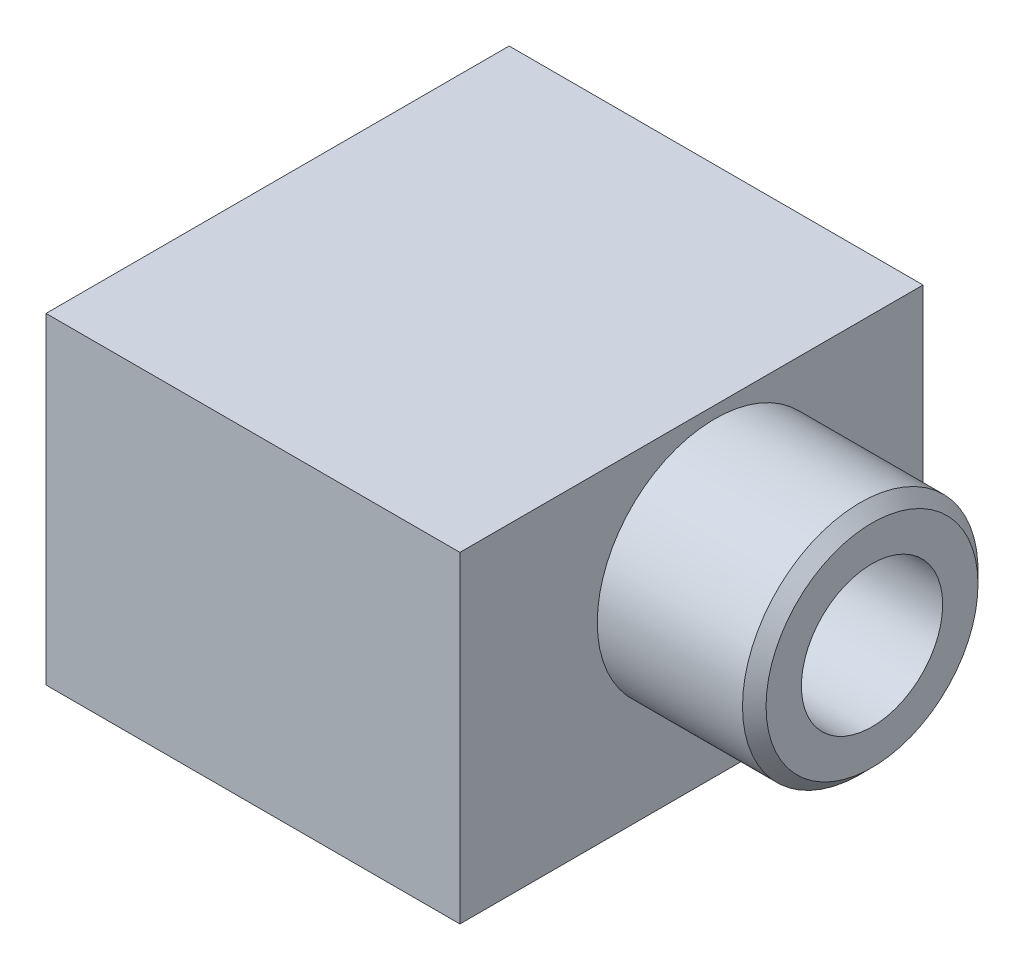
ISO-10303-21;
HEADER;
FILE_DESCRIPTION(('STEP AP214'),'2;1');
FILE_NAME('part.step','',(''),(''),'','','');
FILE_SCHEMA(('AUTOMOTIVE_DESIGN { 1 0 10303 214 1 1 1 1 }'));
ENDSEC;
DATA;
#1=APPLICATION_CONTEXT('core data for automotive mechanical design processes');
#2=APPLICATION_PROTOCOL_DEFINITION('international standard','automotive_design',2000,#1);
#3=PRODUCT_CONTEXT('',#1,'mechanical');
#4=PRODUCT('Part','Part','',(#3));
#5=PRODUCT_RELATED_PRODUCT_CATEGORY('part','',(#4));
#6=PRODUCT_DEFINITION_FORMATION('','',#4);
#7=PRODUCT_DEFINITION_CONTEXT('part definition',#1,'design');
#8=PRODUCT_DEFINITION('design','',#6,#7);
#9=PRODUCT_DEFINITION_SHAPE('','',#8);
#10=(LENGTH_UNIT() NAMED_UNIT(*) SI_UNIT(.MILLI.,.METRE.));
#11=(NAMED_UNIT(*) PLANE_ANGLE_UNIT() SI_UNIT($,.RADIAN.));
#12=(NAMED_UNIT(*) SI_UNIT($,.STERADIAN.) SOLID_ANGLE_UNIT());
#13=UNCERTAINTY_MEASURE_WITH_UNIT(LENGTH_MEASURE(1.E-05),#10,'distance_accuracy_value','');
#14=(GEOMETRIC_REPRESENTATION_CONTEXT(3) GLOBAL_UNCERTAINTY_ASSIGNED_CONTEXT((#13)) GLOBAL_UNIT_ASSIGNED_CONTEXT((#10,
#11,#12)) REPRESENTATION_CONTEXT('',''));
#15=CARTESIAN_POINT('',(0.,0.,0.));
#16=DIRECTION('',(0.,0.,1.));
#17=DIRECTION('',(1.,0.,0.));
#18=AXIS2_PLACEMENT_3D('',#15,#16,#17);
#19=CARTESIAN_POINT('',(-4.,-4.9,7.));
#20=DIRECTION('',(0.,1.,0.));
#21=DIRECTION('',(0.,0.,1.));
#22=AXIS2_PLACEMENT_3D('',#19,#20,#21);
#23=PLANE('',#22);
#24=DIRECTION('',(-1.,0.,0.));
#25=VECTOR('',#24,1.);
#26=CARTESIAN_POINT('',(0.,-4.9,6.5));
#27=LINE('',#26,#25);
#28=CARTESIAN_POINT('',(-4.,-4.9,6.5));
#29=VERTEX_POINT('',#28);
#30=CARTESIAN_POINT('',(-14.5458451293479,-4.9,6.5));
#31=VERTEX_POINT('',#30);
#32=EDGE_CURVE('E36',#29,#31,#27,.T.);
#33=ORIENTED_EDGE('',*,*,#32,.T.);
#34=DIRECTION('',(0.,0.,1.));
#35=VECTOR('',#34,1.);
#36=CARTESIAN_POINT('',(-14.5458451293479,-4.9,-5.3));
#37=LINE('',#36,#35);
#38=CARTESIAN_POINT('',(-14.5458451293479,-4.9,-5.3));
#39=VERTEX_POINT('',#38);
#40=EDGE_CURVE('E48',#39,#31,#37,.T.);
#41=ORIENTED_EDGE('',*,*,#40,.F.);
#42=DIRECTION('',(1.,0.,0.));
#43=VECTOR('',#42,1.);
#44=CARTESIAN_POINT('',(-4.,-4.9,-5.3));
#45=LINE('',#44,#43);
#46=CARTESIAN_POINT('',(-4.,-4.9,-5.3));
#47=VERTEX_POINT('',#46);
#48=EDGE_CURVE('E95',#39,#47,#45,.T.);
#49=ORIENTED_EDGE('',*,*,#48,.T.);
#50=DIRECTION('',(0.,0.,1.));
#51=VECTOR('',#50,1.);
#52=CARTESIAN_POINT('',(-4.,-4.9,-5.3));
#53=LINE('',#52,#51);
#54=EDGE_CURVE('E82',#47,#29,#53,.T.);
#55=ORIENTED_EDGE('',*,*,#54,.T.);
#56=EDGE_LOOP('',(#33,#41,#49,#55));
#57=FACE_BOUND('',#56,.T.);
#58=ADVANCED_FACE('F32',(#57),#23,.F.);
#59=CARTESIAN_POINT('',(-4.,3.3,-5.3));
#60=DIRECTION('',(-1.,0.,0.));
#61=DIRECTION('',(0.,0.,1.));
#62=AXIS2_PLACEMENT_3D('',#59,#60,#61);
#63=PLANE('',#62);
#64=CARTESIAN_POINT('',(-4.,0.,0.));
#65=DIRECTION('',(-1.,0.,0.));
#66=DIRECTION('',(0.,0.,1.));
#67=AXIS2_PLACEMENT_3D('',#64,#65,#66);
#68=CIRCLE('',#67,3.);
#69=CARTESIAN_POINT('',(-4.,0.,3.));
#70=VERTEX_POINT('',#69);
#71=EDGE_CURVE('E100',#70,#70,#68,.F.);
#72=ORIENTED_EDGE('',*,*,#71,.F.);
#73=EDGE_LOOP('',(#72));
#74=FACE_BOUND('',#73,.T.);
#75=DIRECTION('',(0.,1.,0.));
#76=VECTOR('',#75,1.);
#77=CARTESIAN_POINT('',(-4.,3.3,6.5));
#78=LINE('',#77,#76);
#79=CARTESIAN_POINT('',(-4.,3.3,6.5));
#80=VERTEX_POINT('',#79);
#81=EDGE_CURVE('E11',#29,#80,#78,.T.);
#82=ORIENTED_EDGE('',*,*,#81,.F.);
#83=ORIENTED_EDGE('',*,*,#54,.F.);
#84=DIRECTION('',(0.,1.,0.));
#85=VECTOR('',#84,1.);
#86=CARTESIAN_POINT('',(-4.,3.3,-5.3));
#87=LINE('',#86,#85);
#88=CARTESIAN_POINT('',(-4.,3.3,-5.3));
#89=VERTEX_POINT('',#88);
#90=EDGE_CURVE('E79',#47,#89,#87,.T.);
#91=ORIENTED_EDGE('',*,*,#90,.T.);
#92=DIRECTION('',(0.,0.,1.));
#93=VECTOR('',#92,1.);
#94=CARTESIAN_POINT('',(-4.,3.3,7.));
#95=LINE('',#94,#93);
#96=EDGE_CURVE('E70',#80,#89,#95,.F.);
#97=ORIENTED_EDGE('',*,*,#96,.F.);
#98=EDGE_LOOP('',(#82,#83,#91,#97));
#99=FACE_BOUND('',#98,.T.);
#100=ADVANCED_FACE('F80',(#74,#99),#63,.F.);
#101=CARTESIAN_POINT('',(-4.,3.3,7.));
#102=DIRECTION('',(0.,1.,0.));
#103=DIRECTION('',(0.,0.,1.));
#104=AXIS2_PLACEMENT_3D('',#101,#102,#103);
#105=PLANE('',#104);
#106=DIRECTION('',(0.,0.,1.));
#107=VECTOR('',#106,1.);
#108=CARTESIAN_POINT('',(-14.5458451293479,3.3,-5.3));
#109=LINE('',#108,#107);
#110=CARTESIAN_POINT('',(-14.5458451293479,3.3,-5.3));
#111=VERTEX_POINT('',#110);
#112=CARTESIAN_POINT('',(-14.5458451293479,3.3,6.5));
#113=VERTEX_POINT('',#112);
#114=EDGE_CURVE('E110',#111,#113,#109,.T.);
#115=ORIENTED_EDGE('',*,*,#114,.T.);
#116=DIRECTION('',(1.,0.,0.));
#117=VECTOR('',#116,1.);
#118=CARTESIAN_POINT('',(-4.,3.3,6.5));
#119=LINE('',#118,#117);
#120=EDGE_CURVE('E57',#113,#80,#119,.T.);
#121=ORIENTED_EDGE('',*,*,#120,.T.);
#122=ORIENTED_EDGE('',*,*,#96,.T.);
#123=DIRECTION('',(1.,0.,0.));
#124=VECTOR('',#123,1.);
#125=CARTESIAN_POINT('',(-4.,3.3,-5.3));
#126=LINE('',#125,#124);
#127=EDGE_CURVE('E73',#89,#111,#126,.F.);
#128=ORIENTED_EDGE('',*,*,#127,.T.);
#129=EDGE_LOOP('',(#115,#121,#122,#128));
#130=FACE_BOUND('',#129,.T.);
#131=ADVANCED_FACE('F34',(#130),#105,.T.);
#132=CARTESIAN_POINT('',(-4.,3.3,-5.3));
#133=DIRECTION('',(-1.,0.,0.));
#134=DIRECTION('',(0.,0.,1.));
#135=AXIS2_PLACEMENT_3D('',#132,#133,#134);
#136=PLANE('',#135);
#137=CARTESIAN_POINT('',(-4.,0.,0.));
#138=DIRECTION('',(1.,0.,0.));
#139=DIRECTION('',(0.,0.,-1.));
#140=AXIS2_PLACEMENT_3D('',#137,#138,#139);
#141=CIRCLE('',#140,1.8);
#142=CARTESIAN_POINT('',(-4.,0.,-1.8));
#143=VERTEX_POINT('',#142);
#144=EDGE_CURVE('E89',#143,#143,#141,.T.);
#145=ORIENTED_EDGE('',*,*,#144,.T.);
#146=EDGE_LOOP('',(#145));
#147=FACE_BOUND('',#146,.T.);
#148=ADVANCED_FACE('F139',(#147),#136,.F.);
#149=CARTESIAN_POINT('',(-4.,0.,0.));
#150=DIRECTION('',(1.,0.,0.));
#151=DIRECTION('',(0.,0.,-1.));
#152=AXIS2_PLACEMENT_3D('',#149,#150,#151);
#153=CYLINDRICAL_SURFACE('',#152,1.8);
#154=CARTESIAN_POINT('',(0.,0.,0.));
#155=DIRECTION('',(1.,0.,0.));
#156=DIRECTION('',(0.,0.,-1.));
#157=AXIS2_PLACEMENT_3D('',#154,#155,#156);
#158=CIRCLE('',#157,1.8);
#159=CARTESIAN_POINT('',(0.,0.,-1.8));
#160=VERTEX_POINT('',#159);
#161=EDGE_CURVE('E92',#160,#160,#158,.F.);
#162=ORIENTED_EDGE('',*,*,#161,.F.);
#163=EDGE_LOOP('',(#162));
#164=FACE_BOUND('',#163,.T.);
#165=ORIENTED_EDGE('',*,*,#144,.F.);
#166=EDGE_LOOP('',(#165));
#167=FACE_BOUND('',#166,.T.);
#168=ADVANCED_FACE('F144',(#164,#167),#153,.F.);
#169=CARTESIAN_POINT('',(0.,0.,0.));
#170=DIRECTION('',(1.,0.,0.));
#171=DIRECTION('',(0.,0.,-1.));
#172=AXIS2_PLACEMENT_3D('',#169,#170,#171);
#173=PLANE('',#172);
#174=ORIENTED_EDGE('',*,*,#161,.T.);
#175=EDGE_LOOP('',(#174));
#176=FACE_BOUND('',#175,.T.);
#177=CARTESIAN_POINT('',(-5.6843418860808E-11,0.,0.));
#178=DIRECTION('',(-1.,0.,0.));
#179=DIRECTION('',(0.,0.,1.));
#180=AXIS2_PLACEMENT_3D('',#177,#178,#179);
#181=CIRCLE('',#180,2.70000000000437);
#182=CARTESIAN_POINT('',(-5.6843418860808E-11,0.,2.70000000000437));
#183=VERTEX_POINT('',#182);
#184=EDGE_CURVE('E103',#183,#183,#181,.T.);
#185=ORIENTED_EDGE('',*,*,#184,.F.);
#186=EDGE_LOOP('',(#185));
#187=FACE_BOUND('',#186,.T.);
#188=ADVANCED_FACE('F150',(#176,#187),#173,.T.);
#189=CARTESIAN_POINT('',(-0.300000000038381,0.,0.));
#190=DIRECTION('',(-1.,0.,0.));
#191=DIRECTION('',(0.,0.,1.));
#192=AXIS2_PLACEMENT_3D('',#189,#190,#191);
#193=CONICAL_SURFACE('',#192,2.9999999999859,0.785398163397448);
#194=CARTESIAN_POINT('',(-0.3,0.,0.));
#195=DIRECTION('',(-1.,0.,0.));
#196=DIRECTION('',(0.,0.,1.));
#197=AXIS2_PLACEMENT_3D('',#194,#195,#196);
#198=CIRCLE('',#197,3.);
#199=CARTESIAN_POINT('',(-0.3,0.,3.));
#200=VERTEX_POINT('',#199);
#201=EDGE_CURVE('E41',#200,#200,#198,.T.);
#202=ORIENTED_EDGE('',*,*,#201,.F.);
#203=EDGE_LOOP('',(#202));
#204=FACE_BOUND('',#203,.T.);
#205=ORIENTED_EDGE('',*,*,#184,.T.);
#206=EDGE_LOOP('',(#205));
#207=FACE_BOUND('',#206,.T.);
#208=ADVANCED_FACE('F155',(#204,#207),#193,.T.);
#209=CARTESIAN_POINT('',(-4.,0.,0.));
#210=DIRECTION('',(-1.,0.,0.));
#211=DIRECTION('',(0.,0.,1.));
#212=AXIS2_PLACEMENT_3D('',#209,#210,#211);
#213=CYLINDRICAL_SURFACE('',#212,3.);
#214=ORIENTED_EDGE('',*,*,#71,.T.);
#215=EDGE_LOOP('',(#214));
#216=FACE_BOUND('',#215,.T.);
#217=ORIENTED_EDGE('',*,*,#201,.T.);
#218=EDGE_LOOP('',(#217));
#219=FACE_BOUND('',#218,.T.);
#220=ADVANCED_FACE('F130',(#216,#219),#213,.T.);
#221=CARTESIAN_POINT('',(-4.,3.3,-5.3));
#222=DIRECTION('',(0.,0.,1.));
#223=DIRECTION('',(1.,0.,0.));
#224=AXIS2_PLACEMENT_3D('',#221,#222,#223);
#225=PLANE('',#224);
#226=ORIENTED_EDGE('',*,*,#48,.F.);
#227=DIRECTION('',(0.,1.,0.));
#228=VECTOR('',#227,1.);
#229=CARTESIAN_POINT('',(-14.5458451293479,3.3,-5.3));
#230=LINE('',#229,#228);
#231=EDGE_CURVE('E88',#39,#111,#230,.T.);
#232=ORIENTED_EDGE('',*,*,#231,.T.);
#233=ORIENTED_EDGE('',*,*,#127,.F.);
#234=ORIENTED_EDGE('',*,*,#90,.F.);
#235=EDGE_LOOP('',(#226,#232,#233,#234));
#236=FACE_BOUND('',#235,.T.);
#237=ADVANCED_FACE('F87',(#236),#225,.F.);
#238=CARTESIAN_POINT('',(-5.,3.3,6.5));
#239=DIRECTION('',(0.,0.,-1.));
#240=DIRECTION('',(-1.,0.,0.));
#241=AXIS2_PLACEMENT_3D('',#238,#239,#240);
#242=PLANE('',#241);
#243=ORIENTED_EDGE('',*,*,#120,.F.);
#244=DIRECTION('',(0.,1.,0.));
#245=VECTOR('',#244,1.);
#246=CARTESIAN_POINT('',(-14.5458451293479,3.3,6.5));
#247=LINE('',#246,#245);
#248=EDGE_CURVE('E112',#31,#113,#247,.T.);
#249=ORIENTED_EDGE('',*,*,#248,.F.);
#250=ORIENTED_EDGE('',*,*,#32,.F.);
#251=ORIENTED_EDGE('',*,*,#81,.T.);
#252=EDGE_LOOP('',(#243,#249,#250,#251));
#253=FACE_BOUND('',#252,.T.);
#254=ADVANCED_FACE('F119',(#253),#242,.F.);
#255=CARTESIAN_POINT('',(-14.5458451293479,3.3,-5.3));
#256=DIRECTION('',(1.,0.,0.));
#257=DIRECTION('',(0.,0.,-1.));
#258=AXIS2_PLACEMENT_3D('',#255,#256,#257);
#259=PLANE('',#258);
#260=ORIENTED_EDGE('',*,*,#248,.T.);
#261=ORIENTED_EDGE('',*,*,#114,.F.);
#262=ORIENTED_EDGE('',*,*,#231,.F.);
#263=ORIENTED_EDGE('',*,*,#40,.T.);
#264=EDGE_LOOP('',(#260,#261,#262,#263));
#265=FACE_BOUND('',#264,.T.);
#266=ADVANCED_FACE('F115',(#265),#259,.F.);
#267=CLOSED_SHELL('',(#58,#100,#131,#148,#168,#188,#208,#220,#237,#254,#266));
#268=MANIFOLD_SOLID_BREP('B2',#267);
#269=ADVANCED_BREP_SHAPE_REPRESENTATION('',(#18,#268),#14);
#270=SHAPE_DEFINITION_REPRESENTATION(#9,#269);
ENDSEC;
END-ISO-10303-21;
